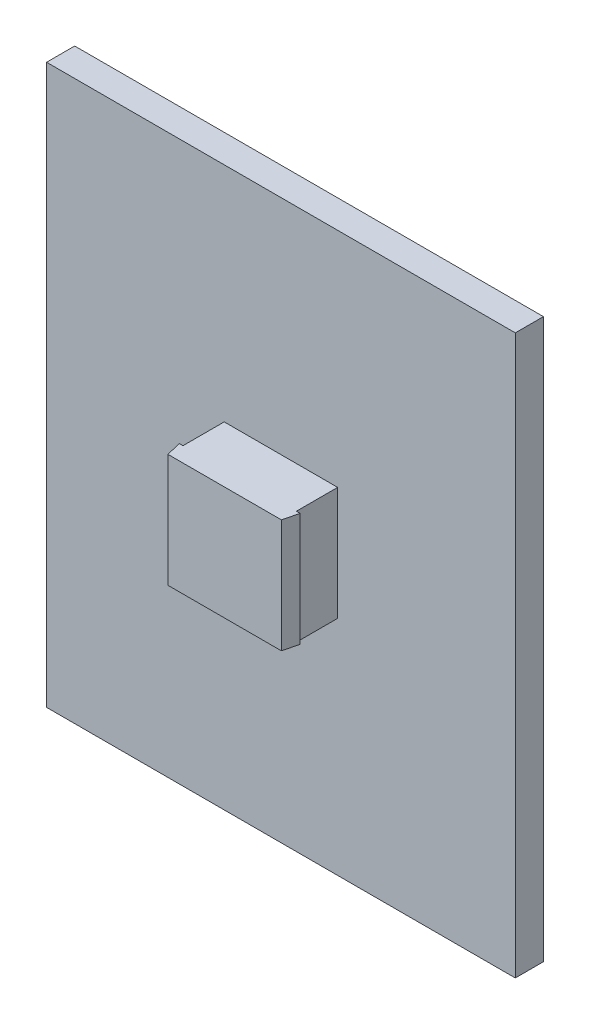
ISO-10303-21;
HEADER;
FILE_DESCRIPTION(('STEP AP214'),'2;1');
FILE_NAME('part.step','',(''),(''),'','','');
FILE_SCHEMA(('AUTOMOTIVE_DESIGN { 1 0 10303 214 1 1 1 1 }'));
ENDSEC;
DATA;
#1=APPLICATION_CONTEXT('core data for automotive mechanical design processes');
#2=APPLICATION_PROTOCOL_DEFINITION('international standard','automotive_design',2000,#1);
#3=PRODUCT_CONTEXT('',#1,'mechanical');
#4=PRODUCT('Part','Part','',(#3));
#5=PRODUCT_RELATED_PRODUCT_CATEGORY('part','',(#4));
#6=PRODUCT_DEFINITION_FORMATION('','',#4);
#7=PRODUCT_DEFINITION_CONTEXT('part definition',#1,'design');
#8=PRODUCT_DEFINITION('design','',#6,#7);
#9=PRODUCT_DEFINITION_SHAPE('','',#8);
#10=(LENGTH_UNIT() NAMED_UNIT(*) SI_UNIT(.MILLI.,.METRE.));
#11=(NAMED_UNIT(*) PLANE_ANGLE_UNIT() SI_UNIT($,.RADIAN.));
#12=(NAMED_UNIT(*) SI_UNIT($,.STERADIAN.) SOLID_ANGLE_UNIT());
#13=UNCERTAINTY_MEASURE_WITH_UNIT(LENGTH_MEASURE(1.E-05),#10,'distance_accuracy_value','');
#14=(GEOMETRIC_REPRESENTATION_CONTEXT(3) GLOBAL_UNCERTAINTY_ASSIGNED_CONTEXT((#13)) GLOBAL_UNIT_ASSIGNED_CONTEXT((#10,
#11,#12)) REPRESENTATION_CONTEXT('',''));
#15=CARTESIAN_POINT('',(0.,0.,0.));
#16=DIRECTION('',(0.,0.,1.));
#17=DIRECTION('',(1.,0.,0.));
#18=AXIS2_PLACEMENT_3D('',#15,#16,#17);
#19=CARTESIAN_POINT('',(12.5,14.9,1.5));
#20=DIRECTION('',(0.,-1.,0.));
#21=DIRECTION('',(0.,0.,-1.));
#22=AXIS2_PLACEMENT_3D('',#19,#20,#21);
#23=PLANE('',#22);
#24=DIRECTION('',(-1.,0.,0.));
#25=VECTOR('',#24,1.);
#26=CARTESIAN_POINT('',(12.5,14.9,0.));
#27=LINE('',#26,#25);
#28=CARTESIAN_POINT('',(12.5,14.9,0.));
#29=VERTEX_POINT('',#28);
#30=CARTESIAN_POINT('',(-12.5,14.9,0.));
#31=VERTEX_POINT('',#30);
#32=EDGE_CURVE('E190',#29,#31,#27,.T.);
#33=ORIENTED_EDGE('',*,*,#32,.T.);
#34=DIRECTION('',(0.,0.,-1.));
#35=VECTOR('',#34,1.);
#36=CARTESIAN_POINT('',(-12.5,14.9,1.5));
#37=LINE('',#36,#35);
#38=CARTESIAN_POINT('',(-12.5,14.9,1.5));
#39=VERTEX_POINT('',#38);
#40=EDGE_CURVE('E11',#39,#31,#37,.T.);
#41=ORIENTED_EDGE('',*,*,#40,.F.);
#42=DIRECTION('',(-1.,0.,0.));
#43=VECTOR('',#42,1.);
#44=CARTESIAN_POINT('',(12.5,14.9,1.5));
#45=LINE('',#44,#43);
#46=CARTESIAN_POINT('',(12.5,14.9,1.5));
#47=VERTEX_POINT('',#46);
#48=EDGE_CURVE('E196',#47,#39,#45,.T.);
#49=ORIENTED_EDGE('',*,*,#48,.F.);
#50=DIRECTION('',(0.,0.,-1.));
#51=VECTOR('',#50,1.);
#52=CARTESIAN_POINT('',(12.5,14.9,1.5));
#53=LINE('',#52,#51);
#54=EDGE_CURVE('E206',#47,#29,#53,.T.);
#55=ORIENTED_EDGE('',*,*,#54,.T.);
#56=EDGE_LOOP('',(#33,#41,#49,#55));
#57=FACE_BOUND('',#56,.T.);
#58=ADVANCED_FACE('F39',(#57),#23,.F.);
#59=CARTESIAN_POINT('',(-12.5,-14.9,1.5));
#60=DIRECTION('',(1.,0.,0.));
#61=DIRECTION('',(0.,0.,-1.));
#62=AXIS2_PLACEMENT_3D('',#59,#60,#61);
#63=PLANE('',#62);
#64=DIRECTION('',(0.,-1.,0.));
#65=VECTOR('',#64,1.);
#66=CARTESIAN_POINT('',(-12.5,-14.9,0.));
#67=LINE('',#66,#65);
#68=CARTESIAN_POINT('',(-12.5,-14.9,0.));
#69=VERTEX_POINT('',#68);
#70=EDGE_CURVE('E209',#31,#69,#67,.T.);
#71=ORIENTED_EDGE('',*,*,#70,.T.);
#72=DIRECTION('',(0.,0.,-1.));
#73=VECTOR('',#72,1.);
#74=CARTESIAN_POINT('',(-12.5,-14.9,1.5));
#75=LINE('',#74,#73);
#76=CARTESIAN_POINT('',(-12.5,-14.9,1.5));
#77=VERTEX_POINT('',#76);
#78=EDGE_CURVE('E46',#77,#69,#75,.T.);
#79=ORIENTED_EDGE('',*,*,#78,.F.);
#80=DIRECTION('',(0.,-1.,0.));
#81=VECTOR('',#80,1.);
#82=CARTESIAN_POINT('',(-12.5,-14.9,1.5));
#83=LINE('',#82,#81);
#84=EDGE_CURVE('E199',#39,#77,#83,.T.);
#85=ORIENTED_EDGE('',*,*,#84,.F.);
#86=ORIENTED_EDGE('',*,*,#40,.T.);
#87=EDGE_LOOP('',(#71,#79,#85,#86));
#88=FACE_BOUND('',#87,.T.);
#89=ADVANCED_FACE('F239',(#88),#63,.F.);
#90=CARTESIAN_POINT('',(12.5,-14.9,1.5));
#91=DIRECTION('',(0.,1.,0.));
#92=DIRECTION('',(0.,0.,1.));
#93=AXIS2_PLACEMENT_3D('',#90,#91,#92);
#94=PLANE('',#93);
#95=DIRECTION('',(1.,0.,0.));
#96=VECTOR('',#95,1.);
#97=CARTESIAN_POINT('',(12.5,-14.9,0.));
#98=LINE('',#97,#96);
#99=CARTESIAN_POINT('',(12.5,-14.9,0.));
#100=VERTEX_POINT('',#99);
#101=EDGE_CURVE('E211',#69,#100,#98,.T.);
#102=ORIENTED_EDGE('',*,*,#101,.T.);
#103=DIRECTION('',(0.,0.,-1.));
#104=VECTOR('',#103,1.);
#105=CARTESIAN_POINT('',(12.5,-14.9,1.5));
#106=LINE('',#105,#104);
#107=CARTESIAN_POINT('',(12.5,-14.9,1.5));
#108=VERTEX_POINT('',#107);
#109=EDGE_CURVE('E216',#108,#100,#106,.T.);
#110=ORIENTED_EDGE('',*,*,#109,.F.);
#111=DIRECTION('',(1.,0.,0.));
#112=VECTOR('',#111,1.);
#113=CARTESIAN_POINT('',(12.5,-14.9,1.5));
#114=LINE('',#113,#112);
#115=EDGE_CURVE('E202',#77,#108,#114,.T.);
#116=ORIENTED_EDGE('',*,*,#115,.F.);
#117=ORIENTED_EDGE('',*,*,#78,.T.);
#118=EDGE_LOOP('',(#102,#110,#116,#117));
#119=FACE_BOUND('',#118,.T.);
#120=ADVANCED_FACE('F223',(#119),#94,.F.);
#121=CARTESIAN_POINT('',(12.5,-14.9,1.5));
#122=DIRECTION('',(-1.,0.,0.));
#123=DIRECTION('',(0.,0.,1.));
#124=AXIS2_PLACEMENT_3D('',#121,#122,#123);
#125=PLANE('',#124);
#126=DIRECTION('',(0.,1.,0.));
#127=VECTOR('',#126,1.);
#128=CARTESIAN_POINT('',(12.5,-14.9,0.));
#129=LINE('',#128,#127);
#130=EDGE_CURVE('E200',#100,#29,#129,.T.);
#131=ORIENTED_EDGE('',*,*,#130,.T.);
#132=ORIENTED_EDGE('',*,*,#54,.F.);
#133=DIRECTION('',(0.,1.,0.));
#134=VECTOR('',#133,1.);
#135=CARTESIAN_POINT('',(12.5,-14.9,1.5));
#136=LINE('',#135,#134);
#137=EDGE_CURVE('E204',#108,#47,#136,.T.);
#138=ORIENTED_EDGE('',*,*,#137,.F.);
#139=ORIENTED_EDGE('',*,*,#109,.T.);
#140=EDGE_LOOP('',(#131,#132,#138,#139));
#141=FACE_BOUND('',#140,.T.);
#142=ADVANCED_FACE('F232',(#141),#125,.F.);
#143=CARTESIAN_POINT('',(0.,0.,1.5));
#144=DIRECTION('',(0.,0.,-1.));
#145=DIRECTION('',(-1.,0.,0.));
#146=AXIS2_PLACEMENT_3D('',#143,#144,#145);
#147=PLANE('',#146);
#148=DIRECTION('',(1.,0.,0.));
#149=VECTOR('',#148,1.);
#150=CARTESIAN_POINT('',(-3.025,-3.025,1.5));
#151=LINE('',#150,#149);
#152=CARTESIAN_POINT('',(-3.025,-3.025,1.5));
#153=VERTEX_POINT('',#152);
#154=CARTESIAN_POINT('',(3.025,-3.025,1.5));
#155=VERTEX_POINT('',#154);
#156=EDGE_CURVE('E171',#153,#155,#151,.T.);
#157=ORIENTED_EDGE('',*,*,#156,.F.);
#158=DIRECTION('',(0.,1.,0.));
#159=VECTOR('',#158,1.);
#160=CARTESIAN_POINT('',(-3.025,-3.025,1.5));
#161=LINE('',#160,#159);
#162=CARTESIAN_POINT('',(-3.025,3.025,1.5));
#163=VERTEX_POINT('',#162);
#164=EDGE_CURVE('E159',#153,#163,#161,.T.);
#165=ORIENTED_EDGE('',*,*,#164,.T.);
#166=DIRECTION('',(1.,0.,0.));
#167=VECTOR('',#166,1.);
#168=CARTESIAN_POINT('',(-3.025,3.025,1.5));
#169=LINE('',#168,#167);
#170=CARTESIAN_POINT('',(3.025,3.025,1.5));
#171=VERTEX_POINT('',#170);
#172=EDGE_CURVE('E181',#163,#171,#169,.T.);
#173=ORIENTED_EDGE('',*,*,#172,.T.);
#174=DIRECTION('',(0.,1.,0.));
#175=VECTOR('',#174,1.);
#176=CARTESIAN_POINT('',(3.025,-3.025,1.5));
#177=LINE('',#176,#175);
#178=EDGE_CURVE('E184',#155,#171,#177,.T.);
#179=ORIENTED_EDGE('',*,*,#178,.F.);
#180=EDGE_LOOP('',(#157,#165,#173,#179));
#181=FACE_BOUND('',#180,.T.);
#182=ORIENTED_EDGE('',*,*,#48,.T.);
#183=ORIENTED_EDGE('',*,*,#84,.T.);
#184=ORIENTED_EDGE('',*,*,#115,.T.);
#185=ORIENTED_EDGE('',*,*,#137,.T.);
#186=EDGE_LOOP('',(#182,#183,#184,#185));
#187=FACE_BOUND('',#186,.T.);
#188=ADVANCED_FACE('F238',(#181,#187),#147,.F.);
#189=CARTESIAN_POINT('',(0.,0.,0.));
#190=DIRECTION('',(0.,0.,-1.));
#191=DIRECTION('',(-1.,0.,0.));
#192=AXIS2_PLACEMENT_3D('',#189,#190,#191);
#193=PLANE('',#192);
#194=ORIENTED_EDGE('',*,*,#32,.F.);
#195=ORIENTED_EDGE('',*,*,#130,.F.);
#196=ORIENTED_EDGE('',*,*,#101,.F.);
#197=ORIENTED_EDGE('',*,*,#70,.F.);
#198=EDGE_LOOP('',(#194,#195,#196,#197));
#199=FACE_BOUND('',#198,.T.);
#200=ADVANCED_FACE('F229',(#199),#193,.T.);
#201=CARTESIAN_POINT('',(-3.025,-3.025,4.5));
#202=DIRECTION('',(-1.,0.,0.));
#203=DIRECTION('',(0.,0.,1.));
#204=AXIS2_PLACEMENT_3D('',#201,#202,#203);
#205=PLANE('',#204);
#206=DIRECTION('',(0.,1.,0.));
#207=VECTOR('',#206,1.);
#208=CARTESIAN_POINT('',(-3.025,-3.84962112512353,3.7));
#209=LINE('',#208,#207);
#210=CARTESIAN_POINT('',(-3.025,-3.025,3.7));
#211=VERTEX_POINT('',#210);
#212=CARTESIAN_POINT('',(-3.025,3.025,3.7));
#213=VERTEX_POINT('',#212);
#214=EDGE_CURVE('E58',#211,#213,#209,.T.);
#215=ORIENTED_EDGE('',*,*,#214,.T.);
#216=DIRECTION('',(0.,0.,-1.));
#217=VECTOR('',#216,1.);
#218=CARTESIAN_POINT('',(-3.025,3.025,4.5));
#219=LINE('',#218,#217);
#220=EDGE_CURVE('E178',#213,#163,#219,.T.);
#221=ORIENTED_EDGE('',*,*,#220,.T.);
#222=ORIENTED_EDGE('',*,*,#164,.F.);
#223=DIRECTION('',(0.,0.,-1.));
#224=VECTOR('',#223,1.);
#225=CARTESIAN_POINT('',(-3.025,-3.025,4.5));
#226=LINE('',#225,#224);
#227=EDGE_CURVE('E53',#211,#153,#226,.T.);
#228=ORIENTED_EDGE('',*,*,#227,.F.);
#229=EDGE_LOOP('',(#215,#221,#222,#228));
#230=FACE_BOUND('',#229,.T.);
#231=ADVANCED_FACE('F251',(#230),#205,.T.);
#232=CARTESIAN_POINT('',(-3.025,-3.025,4.5));
#233=DIRECTION('',(0.,1.,0.));
#234=DIRECTION('',(0.,0.,1.));
#235=AXIS2_PLACEMENT_3D('',#232,#233,#234);
#236=PLANE('',#235);
#237=ORIENTED_EDGE('',*,*,#156,.T.);
#238=DIRECTION('',(0.,0.,-1.));
#239=VECTOR('',#238,1.);
#240=CARTESIAN_POINT('',(3.025,-3.025,4.5));
#241=LINE('',#240,#239);
#242=CARTESIAN_POINT('',(3.025,-3.025,3.7));
#243=VERTEX_POINT('',#242);
#244=EDGE_CURVE('E191',#243,#155,#241,.T.);
#245=ORIENTED_EDGE('',*,*,#244,.F.);
#246=DIRECTION('',(1.,0.,0.));
#247=VECTOR('',#246,1.);
#248=CARTESIAN_POINT('',(3.025,-3.025,3.7));
#249=LINE('',#248,#247);
#250=CARTESIAN_POINT('',(3.225,-3.025,3.7));
#251=VERTEX_POINT('',#250);
#252=EDGE_CURVE('E157',#243,#251,#249,.T.);
#253=ORIENTED_EDGE('',*,*,#252,.T.);
#254=DIRECTION('',(-0.242535625036333,0.,0.970142500145332));
#255=VECTOR('',#254,1.);
#256=CARTESIAN_POINT('',(3.225,-3.025,3.7));
#257=LINE('',#256,#255);
#258=CARTESIAN_POINT('',(3.025,-3.025,4.5));
#259=VERTEX_POINT('',#258);
#260=EDGE_CURVE('E133',#251,#259,#257,.T.);
#261=ORIENTED_EDGE('',*,*,#260,.T.);
#262=DIRECTION('',(1.,0.,0.));
#263=VECTOR('',#262,1.);
#264=CARTESIAN_POINT('',(-3.025,-3.025,4.5));
#265=LINE('',#264,#263);
#266=CARTESIAN_POINT('',(-3.025,-3.025,4.5));
#267=VERTEX_POINT('',#266);
#268=EDGE_CURVE('E175',#267,#259,#265,.T.);
#269=ORIENTED_EDGE('',*,*,#268,.F.);
#270=DIRECTION('',(-0.242535625036333,0.,-0.970142500145332));
#271=VECTOR('',#270,1.);
#272=CARTESIAN_POINT('',(-3.225,-3.025,3.7));
#273=LINE('',#272,#271);
#274=CARTESIAN_POINT('',(-3.225,-3.025,3.7));
#275=VERTEX_POINT('',#274);
#276=EDGE_CURVE('E160',#267,#275,#273,.T.);
#277=ORIENTED_EDGE('',*,*,#276,.T.);
#278=DIRECTION('',(1.,0.,0.));
#279=VECTOR('',#278,1.);
#280=CARTESIAN_POINT('',(-3.025,-3.025,3.7));
#281=LINE('',#280,#279);
#282=EDGE_CURVE('E162',#275,#211,#281,.T.);
#283=ORIENTED_EDGE('',*,*,#282,.T.);
#284=ORIENTED_EDGE('',*,*,#227,.T.);
#285=EDGE_LOOP('',(#237,#245,#253,#261,#269,#277,#283,#284));
#286=FACE_BOUND('',#285,.T.);
#287=ADVANCED_FACE('F257',(#286),#236,.F.);
#288=CARTESIAN_POINT('',(3.025,-3.025,4.5));
#289=DIRECTION('',(-1.,0.,0.));
#290=DIRECTION('',(0.,0.,1.));
#291=AXIS2_PLACEMENT_3D('',#288,#289,#290);
#292=PLANE('',#291);
#293=DIRECTION('',(0.,0.,-1.));
#294=VECTOR('',#293,1.);
#295=CARTESIAN_POINT('',(3.025,3.025,4.5));
#296=LINE('',#295,#294);
#297=CARTESIAN_POINT('',(3.025,3.025,3.7));
#298=VERTEX_POINT('',#297);
#299=EDGE_CURVE('E193',#298,#171,#296,.T.);
#300=ORIENTED_EDGE('',*,*,#299,.F.);
#301=DIRECTION('',(0.,1.,0.));
#302=VECTOR('',#301,1.);
#303=CARTESIAN_POINT('',(3.025,-3.84962112512353,3.7));
#304=LINE('',#303,#302);
#305=EDGE_CURVE('E135',#243,#298,#304,.T.);
#306=ORIENTED_EDGE('',*,*,#305,.F.);
#307=ORIENTED_EDGE('',*,*,#244,.T.);
#308=ORIENTED_EDGE('',*,*,#178,.T.);
#309=EDGE_LOOP('',(#300,#306,#307,#308));
#310=FACE_BOUND('',#309,.T.);
#311=ADVANCED_FACE('F261',(#310),#292,.F.);
#312=CARTESIAN_POINT('',(-3.025,3.025,4.5));
#313=DIRECTION('',(0.,1.,0.));
#314=DIRECTION('',(0.,0.,1.));
#315=AXIS2_PLACEMENT_3D('',#312,#313,#314);
#316=PLANE('',#315);
#317=ORIENTED_EDGE('',*,*,#172,.F.);
#318=ORIENTED_EDGE('',*,*,#220,.F.);
#319=DIRECTION('',(-1.,0.,0.));
#320=VECTOR('',#319,1.);
#321=CARTESIAN_POINT('',(-3.025,3.025,3.7));
#322=LINE('',#321,#320);
#323=CARTESIAN_POINT('',(-3.225,3.025,3.7));
#324=VERTEX_POINT('',#323);
#325=EDGE_CURVE('E149',#213,#324,#322,.T.);
#326=ORIENTED_EDGE('',*,*,#325,.T.);
#327=DIRECTION('',(0.242535625036333,0.,0.970142500145332));
#328=VECTOR('',#327,1.);
#329=CARTESIAN_POINT('',(-3.225,3.025,3.7));
#330=LINE('',#329,#328);
#331=CARTESIAN_POINT('',(-3.025,3.025,4.5));
#332=VERTEX_POINT('',#331);
#333=EDGE_CURVE('E152',#324,#332,#330,.T.);
#334=ORIENTED_EDGE('',*,*,#333,.T.);
#335=DIRECTION('',(1.,0.,0.));
#336=VECTOR('',#335,1.);
#337=CARTESIAN_POINT('',(-3.025,3.025,4.5));
#338=LINE('',#337,#336);
#339=CARTESIAN_POINT('',(3.025,3.025,4.5));
#340=VERTEX_POINT('',#339);
#341=EDGE_CURVE('E148',#332,#340,#338,.T.);
#342=ORIENTED_EDGE('',*,*,#341,.T.);
#343=DIRECTION('',(0.242535625036333,0.,-0.970142500145332));
#344=VECTOR('',#343,1.);
#345=CARTESIAN_POINT('',(3.225,3.025,3.7));
#346=LINE('',#345,#344);
#347=CARTESIAN_POINT('',(3.225,3.025,3.7));
#348=VERTEX_POINT('',#347);
#349=EDGE_CURVE('E131',#340,#348,#346,.T.);
#350=ORIENTED_EDGE('',*,*,#349,.T.);
#351=DIRECTION('',(-1.,0.,0.));
#352=VECTOR('',#351,1.);
#353=CARTESIAN_POINT('',(3.025,3.025,3.7));
#354=LINE('',#353,#352);
#355=EDGE_CURVE('E136',#348,#298,#354,.T.);
#356=ORIENTED_EDGE('',*,*,#355,.T.);
#357=ORIENTED_EDGE('',*,*,#299,.T.);
#358=EDGE_LOOP('',(#317,#318,#326,#334,#342,#350,#356,#357));
#359=FACE_BOUND('',#358,.T.);
#360=ADVANCED_FACE('F146',(#359),#316,.T.);
#361=CARTESIAN_POINT('',(0.,0.,4.5));
#362=DIRECTION('',(0.,0.,-1.));
#363=DIRECTION('',(-1.,0.,0.));
#364=AXIS2_PLACEMENT_3D('',#361,#362,#363);
#365=PLANE('',#364);
#366=DIRECTION('',(0.,1.,0.));
#367=VECTOR('',#366,1.);
#368=CARTESIAN_POINT('',(-3.025,-3.025,4.5));
#369=LINE('',#368,#367);
#370=EDGE_CURVE('E168',#267,#332,#369,.T.);
#371=ORIENTED_EDGE('',*,*,#370,.F.);
#372=ORIENTED_EDGE('',*,*,#268,.T.);
#373=DIRECTION('',(0.,1.,0.));
#374=VECTOR('',#373,1.);
#375=CARTESIAN_POINT('',(3.025,-3.025,4.5));
#376=LINE('',#375,#374);
#377=EDGE_CURVE('E173',#259,#340,#376,.T.);
#378=ORIENTED_EDGE('',*,*,#377,.T.);
#379=ORIENTED_EDGE('',*,*,#341,.F.);
#380=EDGE_LOOP('',(#371,#372,#378,#379));
#381=FACE_BOUND('',#380,.T.);
#382=ADVANCED_FACE('F260',(#381),#365,.F.);
#383=CARTESIAN_POINT('',(-3.025,-3.84962112512353,3.7));
#384=DIRECTION('',(0.,0.,-1.));
#385=DIRECTION('',(-1.,0.,0.));
#386=AXIS2_PLACEMENT_3D('',#383,#384,#385);
#387=PLANE('',#386);
#388=ORIENTED_EDGE('',*,*,#282,.F.);
#389=DIRECTION('',(0.,1.,0.));
#390=VECTOR('',#389,1.);
#391=CARTESIAN_POINT('',(-3.225,-3.84962112512353,3.7));
#392=LINE('',#391,#390);
#393=EDGE_CURVE('E163',#275,#324,#392,.T.);
#394=ORIENTED_EDGE('',*,*,#393,.T.);
#395=ORIENTED_EDGE('',*,*,#325,.F.);
#396=ORIENTED_EDGE('',*,*,#214,.F.);
#397=EDGE_LOOP('',(#388,#394,#395,#396));
#398=FACE_BOUND('',#397,.T.);
#399=ADVANCED_FACE('F270',(#398),#387,.T.);
#400=CARTESIAN_POINT('',(-3.225,-3.84962112512353,3.7));
#401=DIRECTION('',(-0.970142500145332,0.,0.242535625036333));
#402=DIRECTION('',(0.242535625036333,0.,0.970142500145332));
#403=AXIS2_PLACEMENT_3D('',#400,#401,#402);
#404=PLANE('',#403);
#405=ORIENTED_EDGE('',*,*,#276,.F.);
#406=ORIENTED_EDGE('',*,*,#370,.T.);
#407=ORIENTED_EDGE('',*,*,#333,.F.);
#408=ORIENTED_EDGE('',*,*,#393,.F.);
#409=EDGE_LOOP('',(#405,#406,#407,#408));
#410=FACE_BOUND('',#409,.T.);
#411=ADVANCED_FACE('F272',(#410),#404,.T.);
#412=CARTESIAN_POINT('',(3.225,-3.84962112512353,3.7));
#413=DIRECTION('',(0.970142500145332,0.,0.242535625036333));
#414=DIRECTION('',(0.242535625036333,0.,-0.970142500145332));
#415=AXIS2_PLACEMENT_3D('',#412,#413,#414);
#416=PLANE('',#415);
#417=ORIENTED_EDGE('',*,*,#260,.F.);
#418=DIRECTION('',(0.,1.,0.));
#419=VECTOR('',#418,1.);
#420=CARTESIAN_POINT('',(3.225,-3.84962112512353,3.7));
#421=LINE('',#420,#419);
#422=EDGE_CURVE('E126',#251,#348,#421,.T.);
#423=ORIENTED_EDGE('',*,*,#422,.T.);
#424=ORIENTED_EDGE('',*,*,#349,.F.);
#425=ORIENTED_EDGE('',*,*,#377,.F.);
#426=EDGE_LOOP('',(#417,#423,#424,#425));
#427=FACE_BOUND('',#426,.T.);
#428=ADVANCED_FACE('F128',(#427),#416,.T.);
#429=CARTESIAN_POINT('',(3.025,-3.84962112512353,3.7));
#430=DIRECTION('',(0.,0.,-1.));
#431=DIRECTION('',(-1.,0.,0.));
#432=AXIS2_PLACEMENT_3D('',#429,#430,#431);
#433=PLANE('',#432);
#434=ORIENTED_EDGE('',*,*,#252,.F.);
#435=ORIENTED_EDGE('',*,*,#305,.T.);
#436=ORIENTED_EDGE('',*,*,#355,.F.);
#437=ORIENTED_EDGE('',*,*,#422,.F.);
#438=EDGE_LOOP('',(#434,#435,#436,#437));
#439=FACE_BOUND('',#438,.T.);
#440=ADVANCED_FACE('F139',(#439),#433,.T.);
#441=CLOSED_SHELL('',(#58,#89,#120,#142,#188,#200,#231,#287,#311,#360,#382,#399,#411,#428,#440));
#442=MANIFOLD_SOLID_BREP('B2',#441);
#443=ADVANCED_BREP_SHAPE_REPRESENTATION('',(#18,#442),#14);
#444=SHAPE_DEFINITION_REPRESENTATION(#9,#443);
ENDSEC;
END-ISO-10303-21;
